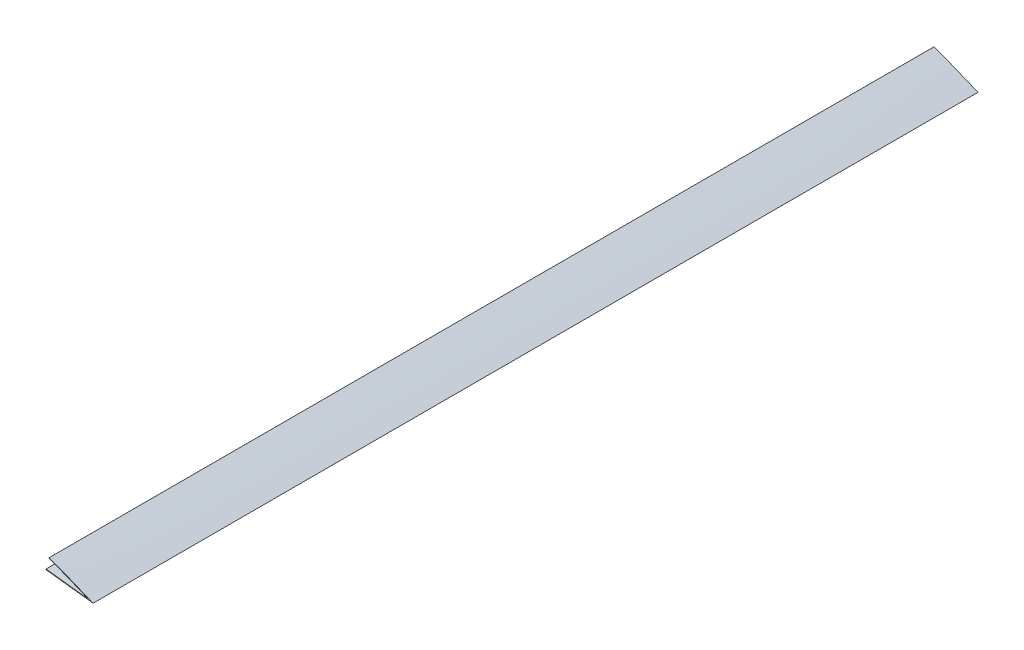
ISO-10303-21;
HEADER;
FILE_DESCRIPTION(('STEP AP214'),'2;1');
FILE_NAME('part.step','',(''),(''),'','','');
FILE_SCHEMA(('AUTOMOTIVE_DESIGN { 1 0 10303 214 1 1 1 1 }'));
ENDSEC;
DATA;
#1=APPLICATION_CONTEXT('core data for automotive mechanical design processes');
#2=APPLICATION_PROTOCOL_DEFINITION('international standard','automotive_design',2000,#1);
#3=PRODUCT_CONTEXT('',#1,'mechanical');
#4=PRODUCT('Part','Part','',(#3));
#5=PRODUCT_RELATED_PRODUCT_CATEGORY('part','',(#4));
#6=PRODUCT_DEFINITION_FORMATION('','',#4);
#7=PRODUCT_DEFINITION_CONTEXT('part definition',#1,'design');
#8=PRODUCT_DEFINITION('design','',#6,#7);
#9=PRODUCT_DEFINITION_SHAPE('','',#8);
#10=(LENGTH_UNIT() NAMED_UNIT(*) SI_UNIT(.MILLI.,.METRE.));
#11=(NAMED_UNIT(*) PLANE_ANGLE_UNIT() SI_UNIT($,.RADIAN.));
#12=(NAMED_UNIT(*) SI_UNIT($,.STERADIAN.) SOLID_ANGLE_UNIT());
#13=UNCERTAINTY_MEASURE_WITH_UNIT(LENGTH_MEASURE(1.E-05),#10,'distance_accuracy_value','');
#14=(GEOMETRIC_REPRESENTATION_CONTEXT(3) GLOBAL_UNCERTAINTY_ASSIGNED_CONTEXT((#13)) GLOBAL_UNIT_ASSIGNED_CONTEXT((#10,
#11,#12)) REPRESENTATION_CONTEXT('',''));
#15=CARTESIAN_POINT('',(0.,0.,0.));
#16=DIRECTION('',(0.,0.,1.));
#17=DIRECTION('',(1.,0.,0.));
#18=AXIS2_PLACEMENT_3D('',#15,#16,#17);
#19=CARTESIAN_POINT('',(1988.02305883041,2944.18599810179,720.725));
#20=CARTESIAN_POINT('',(1988.4860936965,2944.14044059067,720.725));
#21=CARTESIAN_POINT('',(1990.11861976774,2943.97758883364,720.725));
#22=CARTESIAN_POINT('',(1992.87856538639,2943.65192778852,720.725));
#23=CARTESIAN_POINT('',(1996.26056182215,2943.27824299011,720.725));
#24=CARTESIAN_POINT('',(1999.50276368961,2942.88136099166,720.725));
#25=CARTESIAN_POINT('',(2002.59505450618,2942.58817036161,720.725));
#26=CARTESIAN_POINT('',(2005.51427925806,2942.19869931625,720.725));
#27=CARTESIAN_POINT('',(2008.28630101592,2941.92861298624,720.725));
#28=CARTESIAN_POINT('',(2010.88552648472,2941.56905741507,720.725));
#29=CARTESIAN_POINT('',(2013.3339009843,2941.29983663925,720.725));
#30=CARTESIAN_POINT('',(2015.60789868894,2941.03328103495,720.725));
#31=CARTESIAN_POINT('',(2017.70584724161,2940.75505034335,720.725));
#32=CARTESIAN_POINT('',(2019.62940298667,2940.57851809757,720.725));
#33=CARTESIAN_POINT('',(2021.36766207254,2940.31482751687,720.725));
#34=CARTESIAN_POINT('',(2022.93120368427,2940.14747141157,720.725));
#35=CARTESIAN_POINT('',(2024.3197481941,2939.97788358142,720.725));
#36=CARTESIAN_POINT('',(2025.44054917517,2939.81131808059,720.725));
#37=CARTESIAN_POINT('',(2026.11368253309,2939.75555714232,720.725));
#38=CARTESIAN_POINT('',(2026.37812322283,2939.72601974893,720.725));
#39=B_SPLINE_CURVE_WITH_KNOTS('',3,(#19,#20,#21,#22,#23,#24,#25,#26,#27,#28,#29,#30,#31,#32,#33,
#34,#35,#36,#37,#38),.UNSPECIFIED.,.F.,.F.,(4,1,1,1,1,1,1,1,1,1,1,1,1,1,1,1,1,4),
(28.4329806907909,28.4879334748767,28.6267563678009,28.7612032643811,28.8898159231674,
29.0125341125278,29.1280218659914,29.2376094309799,29.3414338076934,29.4378933017833,
29.5285192075717,29.6118543910173,29.6878305241122,29.7565901692537,29.819438039544,
29.8735369008995,29.9218053046442,29.9532403861273),.UNSPECIFIED.);
#40=DIRECTION('',(0.,0.,-1.));
#41=VECTOR('',#40,1.);
#42=SURFACE_OF_LINEAR_EXTRUSION('',#39,#41);
#43=CARTESIAN_POINT('',(1988.02305883041,2944.18599810179,0.));
#44=CARTESIAN_POINT('',(1988.4860936965,2944.14044059067,0.));
#45=CARTESIAN_POINT('',(1990.11861976774,2943.97758883364,0.));
#46=CARTESIAN_POINT('',(1992.87856538639,2943.65192778852,0.));
#47=CARTESIAN_POINT('',(1996.26056182215,2943.27824299011,0.));
#48=CARTESIAN_POINT('',(1999.50276368961,2942.88136099166,0.));
#49=CARTESIAN_POINT('',(2002.59505450618,2942.58817036161,0.));
#50=CARTESIAN_POINT('',(2005.51427925806,2942.19869931625,0.));
#51=CARTESIAN_POINT('',(2008.28630101592,2941.92861298624,0.));
#52=CARTESIAN_POINT('',(2010.88552648472,2941.56905741507,0.));
#53=CARTESIAN_POINT('',(2013.3339009843,2941.29983663925,0.));
#54=CARTESIAN_POINT('',(2015.60789868894,2941.03328103495,0.));
#55=CARTESIAN_POINT('',(2017.70584724161,2940.75505034335,0.));
#56=CARTESIAN_POINT('',(2019.62940298667,2940.57851809757,0.));
#57=CARTESIAN_POINT('',(2021.36766207254,2940.31482751687,0.));
#58=CARTESIAN_POINT('',(2022.93120368427,2940.14747141157,0.));
#59=CARTESIAN_POINT('',(2024.3197481941,2939.97788358142,0.));
#60=CARTESIAN_POINT('',(2025.44054917517,2939.81131808059,0.));
#61=CARTESIAN_POINT('',(2026.11368253309,2939.75555714232,0.));
#62=CARTESIAN_POINT('',(2026.37812322283,2939.72601974893,0.));
#63=B_SPLINE_CURVE_WITH_KNOTS('',3,(#43,#44,#45,#46,#47,#48,#49,#50,#51,#52,#53,#54,#55,#56,#57,
#58,#59,#60,#61,#62),.UNSPECIFIED.,.F.,.F.,(4,1,1,1,1,1,1,1,1,1,1,1,1,1,1,1,1,4),
(28.4329806907909,28.4879334748767,28.6267563678009,28.7612032643811,28.8898159231674,
29.0125341125278,29.1280218659914,29.2376094309799,29.3414338076934,29.4378933017833,
29.5285192075717,29.6118543910173,29.6878305241122,29.7565901692537,29.819438039544,
29.8735369008995,29.9218053046442,29.9532403861273),.UNSPECIFIED.);
#64=CARTESIAN_POINT('',(1988.02305883041,2944.18599810179,0.));
#65=VERTEX_POINT('',#64);
#66=CARTESIAN_POINT('',(2026.37812322283,2939.72601974893,0.));
#67=VERTEX_POINT('',#66);
#68=EDGE_CURVE('E172',#65,#67,#63,.T.);
#69=ORIENTED_EDGE('',*,*,#68,.T.);
#70=DIRECTION('',(0.,0.,-1.));
#71=VECTOR('',#70,1.);
#72=CARTESIAN_POINT('',(2026.37812322283,2939.72601974893,720.725));
#73=LINE('',#72,#71);
#74=CARTESIAN_POINT('',(2026.37812322283,2939.72601974893,720.725));
#75=VERTEX_POINT('',#74);
#76=EDGE_CURVE('E11',#75,#67,#73,.T.);
#77=ORIENTED_EDGE('',*,*,#76,.F.);
#78=CARTESIAN_POINT('',(1988.02305883041,2944.18599810179,720.725));
#79=VERTEX_POINT('',#78);
#80=EDGE_CURVE('E144',#79,#75,#39,.T.);
#81=ORIENTED_EDGE('',*,*,#80,.F.);
#82=DIRECTION('',(0.,0.,-1.));
#83=VECTOR('',#82,1.);
#84=CARTESIAN_POINT('',(1988.02305883041,2944.18599810179,720.725));
#85=LINE('',#84,#83);
#86=EDGE_CURVE('E114',#79,#65,#85,.T.);
#87=ORIENTED_EDGE('',*,*,#86,.T.);
#88=EDGE_LOOP('',(#69,#77,#81,#87));
#89=FACE_BOUND('',#88,.T.);
#90=ADVANCED_FACE('F33',(#89),#42,.F.);
#91=CARTESIAN_POINT('',(2026.37812322283,2939.72601974893,720.725));
#92=CARTESIAN_POINT('',(2025.7723670329,2939.96681770488,720.725));
#93=CARTESIAN_POINT('',(2025.16700119327,2940.20806577561,720.725));
#94=CARTESIAN_POINT('',(2024.56327016065,2940.45119895005,720.725));
#95=CARTESIAN_POINT('',(2024.25244988756,2940.57637177635,720.725));
#96=CARTESIAN_POINT('',(2023.94206292393,2940.70204425383,720.725));
#97=CARTESIAN_POINT('',(2023.63227908525,2940.82841219755,720.725));
#98=CARTESIAN_POINT('',(2019.92290730254,2942.34155015426,720.725));
#99=CARTESIAN_POINT('',(2016.30001050763,2943.95440282884,720.725));
#100=CARTESIAN_POINT('',(2008.84038212805,2946.88486291156,720.725));
#101=CARTESIAN_POINT('',(2005.18204635352,2948.44600331714,720.725));
#102=CARTESIAN_POINT('',(1998.49830218971,2950.9925617946,720.725));
#103=CARTESIAN_POINT('',(1995.57534901207,2952.14370847279,720.725));
#104=CARTESIAN_POINT('',(1991.93586782327,2953.47362866195,720.725));
#105=CARTESIAN_POINT('',(1991.26652278171,2953.72164072025,720.725));
#106=CARTESIAN_POINT('',(1990.59802874074,2953.97095841238,720.725));
#107=B_SPLINE_CURVE_WITH_KNOTS('',3,(#91,#92,#93,#94,#95,#96,#97,#98,#99,#100,#101,#102,#103,
#104,#105,#106),.UNSPECIFIED.,.F.,.F.,(4,3,3,2,2,2,4),(0.099020879068913,0.175577173941332,
0.214990831999981,0.686932530696415,1.15887422939285,1.53165502309098,1.61589570104789),.UNSPECIFIED.);
#108=DIRECTION('',(0.,0.,-1.));
#109=VECTOR('',#108,1.);
#110=SURFACE_OF_LINEAR_EXTRUSION('',#107,#109);
#111=CARTESIAN_POINT('',(2026.37812322283,2939.72601974893,0.));
#112=CARTESIAN_POINT('',(2025.7723670329,2939.96681770488,0.));
#113=CARTESIAN_POINT('',(2025.16700119327,2940.20806577561,0.));
#114=CARTESIAN_POINT('',(2024.56327016065,2940.45119895005,0.));
#115=CARTESIAN_POINT('',(2024.25244988756,2940.57637177635,0.));
#116=CARTESIAN_POINT('',(2023.94206292393,2940.70204425383,0.));
#117=CARTESIAN_POINT('',(2023.63227908525,2940.82841219755,0.));
#118=CARTESIAN_POINT('',(2019.92290730254,2942.34155015426,0.));
#119=CARTESIAN_POINT('',(2016.30001050763,2943.95440282884,0.));
#120=CARTESIAN_POINT('',(2008.84038212805,2946.88486291156,0.));
#121=CARTESIAN_POINT('',(2005.18204635352,2948.44600331714,0.));
#122=CARTESIAN_POINT('',(1998.49830218971,2950.9925617946,0.));
#123=CARTESIAN_POINT('',(1995.57534901207,2952.14370847279,0.));
#124=CARTESIAN_POINT('',(1991.93586782327,2953.47362866195,0.));
#125=CARTESIAN_POINT('',(1991.26652278171,2953.72164072025,0.));
#126=CARTESIAN_POINT('',(1990.59802874074,2953.97095841238,0.));
#127=B_SPLINE_CURVE_WITH_KNOTS('',3,(#111,#112,#113,#114,#115,#116,#117,#118,#119,#120,#121,
#122,#123,#124,#125,#126),.UNSPECIFIED.,.F.,.F.,(4,3,3,2,2,2,4),(0.099020879068913,
0.175577173941332,0.214990831999981,0.686932530696415,1.15887422939285,1.53165502309098,
1.61589570104789),.UNSPECIFIED.);
#128=CARTESIAN_POINT('',(1990.59802874074,2953.97095841238,0.));
#129=VERTEX_POINT('',#128);
#130=EDGE_CURVE('E170',#67,#129,#127,.T.);
#131=ORIENTED_EDGE('',*,*,#130,.T.);
#132=DIRECTION('',(0.,0.,-1.));
#133=VECTOR('',#132,1.);
#134=CARTESIAN_POINT('',(1990.59802874074,2953.97095841238,720.725));
#135=LINE('',#134,#133);
#136=CARTESIAN_POINT('',(1990.59802874074,2953.97095841238,720.725));
#137=VERTEX_POINT('',#136);
#138=EDGE_CURVE('E42',#137,#129,#135,.T.);
#139=ORIENTED_EDGE('',*,*,#138,.F.);
#140=EDGE_CURVE('E87',#75,#137,#107,.T.);
#141=ORIENTED_EDGE('',*,*,#140,.F.);
#142=ORIENTED_EDGE('',*,*,#76,.T.);
#143=EDGE_LOOP('',(#131,#139,#141,#142));
#144=FACE_BOUND('',#143,.T.);
#145=ADVANCED_FACE('F137',(#144),#110,.F.);
#146=CARTESIAN_POINT('',(1990.42148669339,2953.49755342874,720.725));
#147=DIRECTION('',(0.936968441110629,-0.349413995659473,0.));
#148=DIRECTION('',(0.349413995659473,0.936968441110629,0.));
#149=AXIS2_PLACEMENT_3D('',#146,#147,#148);
#150=PLANE('',#149);
#151=DIRECTION('',(-0.349413995659473,-0.936968441110629,0.));
#152=VECTOR('',#151,1.);
#153=CARTESIAN_POINT('',(1990.42148669339,2953.49755342874,0.));
#154=LINE('',#153,#152);
#155=CARTESIAN_POINT('',(1990.42148669339,2953.49755342874,0.));
#156=VERTEX_POINT('',#155);
#157=EDGE_CURVE('E166',#129,#156,#154,.T.);
#158=ORIENTED_EDGE('',*,*,#157,.T.);
#159=DIRECTION('',(0.,0.,-1.));
#160=VECTOR('',#159,1.);
#161=CARTESIAN_POINT('',(1990.42148669339,2953.49755342874,720.725));
#162=LINE('',#161,#160);
#163=CARTESIAN_POINT('',(1990.42148669339,2953.49755342874,720.725));
#164=VERTEX_POINT('',#163);
#165=EDGE_CURVE('E109',#164,#156,#162,.T.);
#166=ORIENTED_EDGE('',*,*,#165,.F.);
#167=DIRECTION('',(-0.349413995659473,-0.936968441110629,0.));
#168=VECTOR('',#167,1.);
#169=CARTESIAN_POINT('',(1990.42148669339,2953.49755342874,720.725));
#170=LINE('',#169,#168);
#171=EDGE_CURVE('E100',#137,#164,#170,.T.);
#172=ORIENTED_EDGE('',*,*,#171,.F.);
#173=ORIENTED_EDGE('',*,*,#138,.T.);
#174=EDGE_LOOP('',(#158,#166,#172,#173));
#175=FACE_BOUND('',#174,.T.);
#176=ADVANCED_FACE('F135',(#175),#150,.F.);
#177=CARTESIAN_POINT('',(1990.42148669339,2953.49755342874,720.725));
#178=CARTESIAN_POINT('',(1991.26608646929,2953.18432727958,720.725));
#179=CARTESIAN_POINT('',(1992.11061416994,2952.87083292376,720.725));
#180=CARTESIAN_POINT('',(1997.44616335028,2950.89237515585,720.725));
#181=CARTESIAN_POINT('',(2001.86633493205,2949.19683033505,720.725));
#182=CARTESIAN_POINT('',(2010.80211572768,2945.57558877682,720.725));
#183=CARTESIAN_POINT('',(2015.21732369742,2943.78783922893,720.725));
#184=CARTESIAN_POINT('',(2020.71630821281,2941.50699908588,720.725));
#185=CARTESIAN_POINT('',(2021.79802890697,2941.06151206462,720.725));
#186=CARTESIAN_POINT('',(2022.86646084304,2940.6145709774,720.725));
#187=B_SPLINE_CURVE_WITH_KNOTS('',3,(#177,#178,#179,#180,#181,#182,#183,#184,#185,#186),
.UNSPECIFIED.,.F.,.F.,(4,2,2,2,4),(0.2403730921367,0.346917733175911,0.913321397798007,
1.4797250624201,1.6161767153474),.UNSPECIFIED.);
#188=DIRECTION('',(0.,0.,-1.));
#189=VECTOR('',#188,1.);
#190=SURFACE_OF_LINEAR_EXTRUSION('',#187,#189);
#191=CARTESIAN_POINT('',(1990.42148669339,2953.49755342874,0.));
#192=CARTESIAN_POINT('',(1991.26608646929,2953.18432727958,0.));
#193=CARTESIAN_POINT('',(1992.11061416994,2952.87083292376,0.));
#194=CARTESIAN_POINT('',(1997.44616335028,2950.89237515585,0.));
#195=CARTESIAN_POINT('',(2001.86633493205,2949.19683033505,0.));
#196=CARTESIAN_POINT('',(2010.80211572768,2945.57558877682,0.));
#197=CARTESIAN_POINT('',(2015.21732369742,2943.78783922893,0.));
#198=CARTESIAN_POINT('',(2020.71630821281,2941.50699908588,0.));
#199=CARTESIAN_POINT('',(2021.79802890697,2941.06151206462,0.));
#200=CARTESIAN_POINT('',(2022.86646084304,2940.6145709774,0.));
#201=B_SPLINE_CURVE_WITH_KNOTS('',3,(#191,#192,#193,#194,#195,#196,#197,#198,#199,#200),
.UNSPECIFIED.,.F.,.F.,(4,2,2,2,4),(0.2403730921367,0.346917733175911,0.913321397798007,
1.4797250624201,1.6161767153474),.UNSPECIFIED.);
#202=CARTESIAN_POINT('',(2022.86646084304,2940.6145709774,0.));
#203=VERTEX_POINT('',#202);
#204=EDGE_CURVE('E108',#156,#203,#201,.T.);
#205=ORIENTED_EDGE('',*,*,#204,.T.);
#206=DIRECTION('',(0.,0.,-1.));
#207=VECTOR('',#206,1.);
#208=CARTESIAN_POINT('',(2022.86646084304,2940.6145709774,720.725));
#209=LINE('',#208,#207);
#210=CARTESIAN_POINT('',(2022.86646084304,2940.6145709774,720.725));
#211=VERTEX_POINT('',#210);
#212=EDGE_CURVE('E105',#211,#203,#209,.T.);
#213=ORIENTED_EDGE('',*,*,#212,.F.);
#214=EDGE_CURVE('E94',#164,#211,#187,.T.);
#215=ORIENTED_EDGE('',*,*,#214,.F.);
#216=ORIENTED_EDGE('',*,*,#165,.T.);
#217=EDGE_LOOP('',(#205,#213,#215,#216));
#218=FACE_BOUND('',#217,.T.);
#219=ADVANCED_FACE('F106',(#218),#190,.F.);
#220=CARTESIAN_POINT('',(2022.86646084304,2940.6145709774,720.725));
#221=CARTESIAN_POINT('',(2018.88458440234,2941.06761583129,720.725));
#222=CARTESIAN_POINT('',(2014.99093126998,2941.58752498364,720.725));
#223=CARTESIAN_POINT('',(2004.5956555186,2942.86683582677,720.725));
#224=CARTESIAN_POINT('',(1998.05216280753,2943.57578634532,720.725));
#225=CARTESIAN_POINT('',(1990.38562197459,2944.45341124992,720.725));
#226=CARTESIAN_POINT('',(1989.23015051689,2944.58289678001,720.725));
#227=CARTESIAN_POINT('',(1988.07460597749,2944.70991009258,720.725));
#228=B_SPLINE_CURVE_WITH_KNOTS('',3,(#220,#221,#222,#223,#224,#225,#226,#227),.UNSPECIFIED.,.F.,
.F.,(4,2,2,4),(28.432746501601,28.9032200601273,29.6765714038467,29.8138144101908),.UNSPECIFIED.);
#229=DIRECTION('',(0.,0.,-1.));
#230=VECTOR('',#229,1.);
#231=SURFACE_OF_LINEAR_EXTRUSION('',#228,#230);
#232=CARTESIAN_POINT('',(2022.86646084304,2940.6145709774,0.));
#233=CARTESIAN_POINT('',(2018.88458440234,2941.06761583129,0.));
#234=CARTESIAN_POINT('',(2014.99093126998,2941.58752498364,0.));
#235=CARTESIAN_POINT('',(2004.5956555186,2942.86683582677,0.));
#236=CARTESIAN_POINT('',(1998.05216280753,2943.57578634532,0.));
#237=CARTESIAN_POINT('',(1990.38562197459,2944.45341124992,0.));
#238=CARTESIAN_POINT('',(1989.23015051689,2944.58289678001,0.));
#239=CARTESIAN_POINT('',(1988.07460597749,2944.70991009258,0.));
#240=B_SPLINE_CURVE_WITH_KNOTS('',3,(#232,#233,#234,#235,#236,#237,#238,#239),.UNSPECIFIED.,.F.,
.F.,(4,2,2,4),(28.432746501601,28.9032200601273,29.6765714038467,29.8138144101908),.UNSPECIFIED.);
#241=CARTESIAN_POINT('',(1988.07460597749,2944.70991009258,0.));
#242=VERTEX_POINT('',#241);
#243=EDGE_CURVE('E73',#203,#242,#240,.T.);
#244=ORIENTED_EDGE('',*,*,#243,.T.);
#245=DIRECTION('',(0.,0.,-1.));
#246=VECTOR('',#245,1.);
#247=CARTESIAN_POINT('',(1988.07460597749,2944.70991009258,720.725));
#248=LINE('',#247,#246);
#249=CARTESIAN_POINT('',(1988.07460597749,2944.70991009258,720.725));
#250=VERTEX_POINT('',#249);
#251=EDGE_CURVE('E110',#250,#242,#248,.T.);
#252=ORIENTED_EDGE('',*,*,#251,.F.);
#253=EDGE_CURVE('E98',#211,#250,#228,.T.);
#254=ORIENTED_EDGE('',*,*,#253,.F.);
#255=ORIENTED_EDGE('',*,*,#212,.T.);
#256=EDGE_LOOP('',(#244,#252,#254,#255));
#257=FACE_BOUND('',#256,.T.);
#258=ADVANCED_FACE('F112',(#257),#231,.F.);
#259=CARTESIAN_POINT('',(1988.07460597749,2944.70991009258,720.725));
#260=DIRECTION('',(0.995194668018483,-0.0979161516174972,0.));
#261=DIRECTION('',(0.0979161516174972,0.995194668018483,0.));
#262=AXIS2_PLACEMENT_3D('',#259,#260,#261);
#263=PLANE('',#262);
#264=DIRECTION('',(-0.0979161516174972,-0.995194668018483,0.));
#265=VECTOR('',#264,1.);
#266=CARTESIAN_POINT('',(1988.07460597749,2944.70991009258,0.));
#267=LINE('',#266,#265);
#268=EDGE_CURVE('E79',#242,#65,#267,.T.);
#269=ORIENTED_EDGE('',*,*,#268,.T.);
#270=ORIENTED_EDGE('',*,*,#86,.F.);
#271=DIRECTION('',(-0.0979161516174972,-0.995194668018483,0.));
#272=VECTOR('',#271,1.);
#273=CARTESIAN_POINT('',(1988.07460597749,2944.70991009258,720.725));
#274=LINE('',#273,#272);
#275=EDGE_CURVE('E50',#250,#79,#274,.T.);
#276=ORIENTED_EDGE('',*,*,#275,.F.);
#277=ORIENTED_EDGE('',*,*,#251,.T.);
#278=EDGE_LOOP('',(#269,#270,#276,#277));
#279=FACE_BOUND('',#278,.T.);
#280=ADVANCED_FACE('F131',(#279),#263,.F.);
#281=CARTESIAN_POINT('',(2007.20939270748,2942.03057340049,720.725));
#282=DIRECTION('',(0.,0.,1.));
#283=DIRECTION('',(1.,0.,0.));
#284=AXIS2_PLACEMENT_3D('',#281,#282,#283);
#285=PLANE('',#284);
#286=ORIENTED_EDGE('',*,*,#80,.T.);
#287=ORIENTED_EDGE('',*,*,#140,.T.);
#288=ORIENTED_EDGE('',*,*,#171,.T.);
#289=ORIENTED_EDGE('',*,*,#214,.T.);
#290=ORIENTED_EDGE('',*,*,#253,.T.);
#291=ORIENTED_EDGE('',*,*,#275,.T.);
#292=EDGE_LOOP('',(#286,#287,#288,#289,#290,#291));
#293=FACE_BOUND('',#292,.T.);
#294=ADVANCED_FACE('F96',(#293),#285,.T.);
#295=CARTESIAN_POINT('',(2007.20939270748,2942.03057340049,0.));
#296=DIRECTION('',(0.,0.,1.));
#297=DIRECTION('',(1.,0.,0.));
#298=AXIS2_PLACEMENT_3D('',#295,#296,#297);
#299=PLANE('',#298);
#300=ORIENTED_EDGE('',*,*,#68,.F.);
#301=ORIENTED_EDGE('',*,*,#268,.F.);
#302=ORIENTED_EDGE('',*,*,#243,.F.);
#303=ORIENTED_EDGE('',*,*,#204,.F.);
#304=ORIENTED_EDGE('',*,*,#157,.F.);
#305=ORIENTED_EDGE('',*,*,#130,.F.);
#306=EDGE_LOOP('',(#300,#301,#302,#303,#304,#305));
#307=FACE_BOUND('',#306,.T.);
#308=ADVANCED_FACE('F169',(#307),#299,.F.);
#309=CLOSED_SHELL('',(#90,#145,#176,#219,#258,#280,#294,#308));
#310=MANIFOLD_SOLID_BREP('B2',#309);
#311=ADVANCED_BREP_SHAPE_REPRESENTATION('',(#18,#310),#14);
#312=SHAPE_DEFINITION_REPRESENTATION(#9,#311);
ENDSEC;
END-ISO-10303-21;
